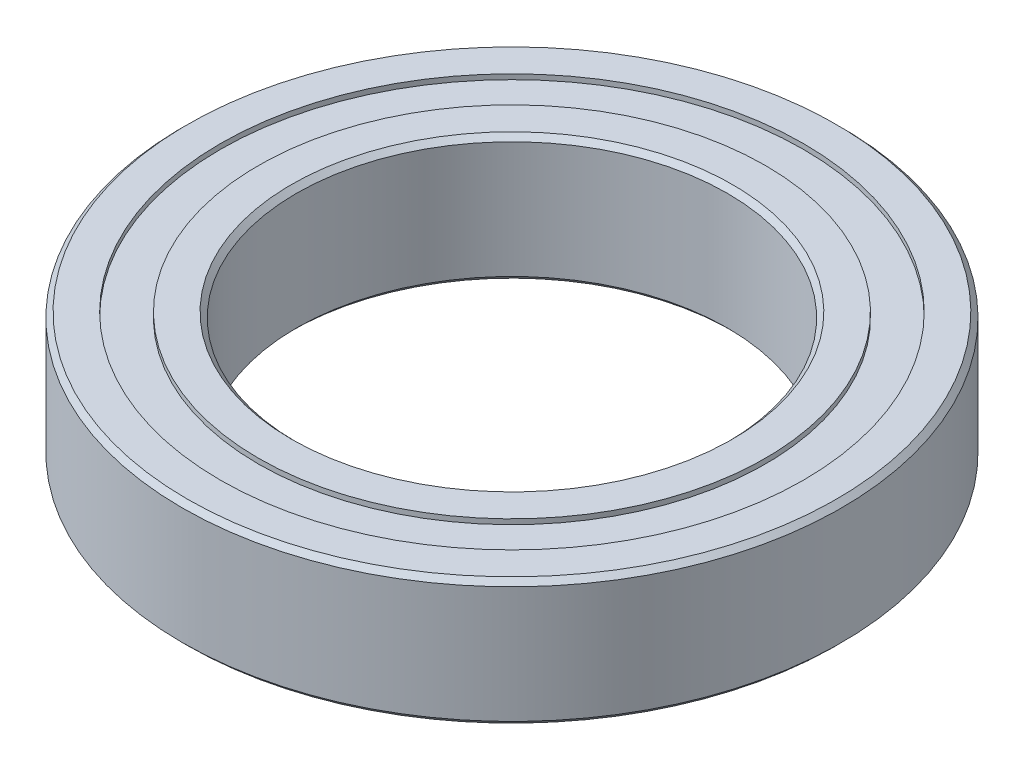
ISO-10303-21;
HEADER;
FILE_DESCRIPTION(('STEP AP214'),'2;1');
FILE_NAME('part.step','',(''),(''),'','','');
FILE_SCHEMA(('AUTOMOTIVE_DESIGN { 1 0 10303 214 1 1 1 1 }'));
ENDSEC;
DATA;
#1=APPLICATION_CONTEXT('core data for automotive mechanical design processes');
#2=APPLICATION_PROTOCOL_DEFINITION('international standard','automotive_design',2000,#1);
#3=PRODUCT_CONTEXT('',#1,'mechanical');
#4=PRODUCT('Part','Part','',(#3));
#5=PRODUCT_RELATED_PRODUCT_CATEGORY('part','',(#4));
#6=PRODUCT_DEFINITION_FORMATION('','',#4);
#7=PRODUCT_DEFINITION_CONTEXT('part definition',#1,'design');
#8=PRODUCT_DEFINITION('design','',#6,#7);
#9=PRODUCT_DEFINITION_SHAPE('','',#8);
#10=(LENGTH_UNIT() NAMED_UNIT(*) SI_UNIT(.MILLI.,.METRE.));
#11=(NAMED_UNIT(*) PLANE_ANGLE_UNIT() SI_UNIT($,.RADIAN.));
#12=(NAMED_UNIT(*) SI_UNIT($,.STERADIAN.) SOLID_ANGLE_UNIT());
#13=UNCERTAINTY_MEASURE_WITH_UNIT(LENGTH_MEASURE(1.E-05),#10,'distance_accuracy_value','');
#14=(GEOMETRIC_REPRESENTATION_CONTEXT(3) GLOBAL_UNCERTAINTY_ASSIGNED_CONTEXT((#13)) GLOBAL_UNIT_ASSIGNED_CONTEXT((#10,
#11,#12)) REPRESENTATION_CONTEXT('',''));
#15=CARTESIAN_POINT('',(0.,0.,0.));
#16=DIRECTION('',(0.,0.,1.));
#17=DIRECTION('',(1.,0.,0.));
#18=AXIS2_PLACEMENT_3D('',#15,#16,#17);
#19=CARTESIAN_POINT('',(0.,0.,0.));
#20=DIRECTION('',(0.,1.,0.));
#21=DIRECTION('',(0.,0.,1.));
#22=AXIS2_PLACEMENT_3D('',#19,#20,#21);
#23=PLANE('',#22);
#24=CARTESIAN_POINT('',(0.,0.,0.));
#25=DIRECTION('',(0.,1.,0.));
#26=DIRECTION('',(0.,0.,1.));
#27=AXIS2_PLACEMENT_3D('',#24,#25,#26);
#28=CIRCLE('',#27,8.7);
#29=CARTESIAN_POINT('',(0.,0.,8.7));
#30=VERTEX_POINT('',#29);
#31=EDGE_CURVE('E10',#30,#30,#28,.T.);
#32=ORIENTED_EDGE('',*,*,#31,.T.);
#33=EDGE_LOOP('',(#32));
#34=FACE_BOUND('',#33,.T.);
#35=CARTESIAN_POINT('',(0.,0.,0.));
#36=DIRECTION('',(0.,-1.,0.));
#37=DIRECTION('',(0.,0.,-1.));
#38=AXIS2_PLACEMENT_3D('',#35,#36,#37);
#39=CIRCLE('',#38,10.);
#40=CARTESIAN_POINT('',(0.,0.,-10.));
#41=VERTEX_POINT('',#40);
#42=EDGE_CURVE('E87',#41,#41,#39,.T.);
#43=ORIENTED_EDGE('',*,*,#42,.T.);
#44=EDGE_LOOP('',(#43));
#45=FACE_BOUND('',#44,.T.);
#46=ADVANCED_FACE('F35',(#34,#45),#23,.F.);
#47=CARTESIAN_POINT('',(0.,5.,0.));
#48=DIRECTION('',(0.,1.,0.));
#49=DIRECTION('',(0.,0.,1.));
#50=AXIS2_PLACEMENT_3D('',#47,#48,#49);
#51=PLANE('',#50);
#52=CARTESIAN_POINT('',(0.,5.,0.));
#53=DIRECTION('',(0.,1.,0.));
#54=DIRECTION('',(0.,0.,1.));
#55=AXIS2_PLACEMENT_3D('',#52,#53,#54);
#56=CIRCLE('',#55,8.70000000000001);
#57=CARTESIAN_POINT('',(0.,5.,8.70000000000001));
#58=VERTEX_POINT('',#57);
#59=EDGE_CURVE('E43',#58,#58,#56,.F.);
#60=ORIENTED_EDGE('',*,*,#59,.T.);
#61=EDGE_LOOP('',(#60));
#62=FACE_BOUND('',#61,.T.);
#63=CARTESIAN_POINT('',(0.,5.,0.));
#64=DIRECTION('',(0.,1.,0.));
#65=DIRECTION('',(0.,0.,1.));
#66=AXIS2_PLACEMENT_3D('',#63,#64,#65);
#67=CIRCLE('',#66,10.);
#68=CARTESIAN_POINT('',(0.,5.,10.));
#69=VERTEX_POINT('',#68);
#70=EDGE_CURVE('E75',#69,#69,#67,.T.);
#71=ORIENTED_EDGE('',*,*,#70,.T.);
#72=EDGE_LOOP('',(#71));
#73=FACE_BOUND('',#72,.T.);
#74=ADVANCED_FACE('F122',(#62,#73),#51,.T.);
#75=CARTESIAN_POINT('',(0.,5.,0.));
#76=DIRECTION('',(0.,1.,0.));
#77=DIRECTION('',(0.,0.,1.));
#78=AXIS2_PLACEMENT_3D('',#75,#76,#77);
#79=CIRCLE('',#78,12.8);
#80=CARTESIAN_POINT('',(0.,5.,12.8));
#81=VERTEX_POINT('',#80);
#82=EDGE_CURVE('E65',#81,#81,#79,.T.);
#83=ORIENTED_EDGE('',*,*,#82,.T.);
#84=EDGE_LOOP('',(#83));
#85=FACE_BOUND('',#84,.T.);
#86=CARTESIAN_POINT('',(0.,5.,0.));
#87=DIRECTION('',(0.,1.,0.));
#88=DIRECTION('',(0.,0.,1.));
#89=AXIS2_PLACEMENT_3D('',#86,#87,#88);
#90=CIRCLE('',#89,11.5);
#91=CARTESIAN_POINT('',(0.,5.,11.5));
#92=VERTEX_POINT('',#91);
#93=EDGE_CURVE('E69',#92,#92,#90,.T.);
#94=ORIENTED_EDGE('',*,*,#93,.F.);
#95=EDGE_LOOP('',(#94));
#96=FACE_BOUND('',#95,.T.);
#97=ADVANCED_FACE('F112',(#85,#96),#51,.T.);
#98=CARTESIAN_POINT('',(0.,0.,0.));
#99=DIRECTION('',(0.,1.,0.));
#100=DIRECTION('',(0.,0.,1.));
#101=AXIS2_PLACEMENT_3D('',#98,#99,#100);
#102=CIRCLE('',#101,12.8);
#103=CARTESIAN_POINT('',(0.,0.,12.8));
#104=VERTEX_POINT('',#103);
#105=EDGE_CURVE('E56',#104,#104,#102,.F.);
#106=ORIENTED_EDGE('',*,*,#105,.T.);
#107=EDGE_LOOP('',(#106));
#108=FACE_BOUND('',#107,.T.);
#109=CARTESIAN_POINT('',(0.,0.,0.));
#110=DIRECTION('',(0.,-1.,0.));
#111=DIRECTION('',(0.,0.,-1.));
#112=AXIS2_PLACEMENT_3D('',#109,#110,#111);
#113=CIRCLE('',#112,11.5);
#114=CARTESIAN_POINT('',(0.,0.,-11.5));
#115=VERTEX_POINT('',#114);
#116=EDGE_CURVE('E81',#115,#115,#113,.T.);
#117=ORIENTED_EDGE('',*,*,#116,.F.);
#118=EDGE_LOOP('',(#117));
#119=FACE_BOUND('',#118,.T.);
#120=ADVANCED_FACE('F109',(#108,#119),#23,.F.);
#121=CARTESIAN_POINT('',(0.,5.,0.));
#122=DIRECTION('',(0.,-1.,0.));
#123=DIRECTION('',(0.,0.,-1.));
#124=AXIS2_PLACEMENT_3D('',#121,#122,#123);
#125=CYLINDRICAL_SURFACE('',#124,13.);
#126=CARTESIAN_POINT('',(0.,4.8,0.));
#127=DIRECTION('',(0.,1.,0.));
#128=DIRECTION('',(0.,0.,1.));
#129=AXIS2_PLACEMENT_3D('',#126,#127,#128);
#130=CIRCLE('',#129,13.);
#131=CARTESIAN_POINT('',(0.,4.8,13.));
#132=VERTEX_POINT('',#131);
#133=EDGE_CURVE('E59',#132,#132,#130,.F.);
#134=ORIENTED_EDGE('',*,*,#133,.T.);
#135=EDGE_LOOP('',(#134));
#136=FACE_BOUND('',#135,.T.);
#137=CARTESIAN_POINT('',(0.,0.199999999999997,0.));
#138=DIRECTION('',(0.,1.,0.));
#139=DIRECTION('',(0.,0.,1.));
#140=AXIS2_PLACEMENT_3D('',#137,#138,#139);
#141=CIRCLE('',#140,13.);
#142=CARTESIAN_POINT('',(0.,0.199999999999997,13.));
#143=VERTEX_POINT('',#142);
#144=EDGE_CURVE('E62',#143,#143,#141,.T.);
#145=ORIENTED_EDGE('',*,*,#144,.T.);
#146=EDGE_LOOP('',(#145));
#147=FACE_BOUND('',#146,.T.);
#148=ADVANCED_FACE('F111',(#136,#147),#125,.T.);
#149=CARTESIAN_POINT('',(0.,5.,0.));
#150=DIRECTION('',(0.,-1.,0.));
#151=DIRECTION('',(0.,0.,-1.));
#152=AXIS2_PLACEMENT_3D('',#149,#150,#151);
#153=CYLINDRICAL_SURFACE('',#152,8.5);
#154=CARTESIAN_POINT('',(0.,4.79999999999999,0.));
#155=DIRECTION('',(0.,1.,0.));
#156=DIRECTION('',(0.,0.,1.));
#157=AXIS2_PLACEMENT_3D('',#154,#155,#156);
#158=CIRCLE('',#157,8.5);
#159=CARTESIAN_POINT('',(0.,4.79999999999999,8.5));
#160=VERTEX_POINT('',#159);
#161=EDGE_CURVE('E47',#160,#160,#158,.T.);
#162=ORIENTED_EDGE('',*,*,#161,.T.);
#163=EDGE_LOOP('',(#162));
#164=FACE_BOUND('',#163,.T.);
#165=CARTESIAN_POINT('',(0.,0.200000000000001,0.));
#166=DIRECTION('',(0.,1.,0.));
#167=DIRECTION('',(0.,0.,1.));
#168=AXIS2_PLACEMENT_3D('',#165,#166,#167);
#169=CIRCLE('',#168,8.5);
#170=CARTESIAN_POINT('',(0.,0.200000000000001,8.5));
#171=VERTEX_POINT('',#170);
#172=EDGE_CURVE('E51',#171,#171,#169,.F.);
#173=ORIENTED_EDGE('',*,*,#172,.T.);
#174=EDGE_LOOP('',(#173));
#175=FACE_BOUND('',#174,.T.);
#176=ADVANCED_FACE('F119',(#164,#175),#153,.F.);
#177=CARTESIAN_POINT('',(0.,4.8,0.));
#178=DIRECTION('',(0.,1.,0.));
#179=DIRECTION('',(0.,0.,1.));
#180=AXIS2_PLACEMENT_3D('',#177,#178,#179);
#181=CYLINDRICAL_SURFACE('',#180,11.5);
#182=CARTESIAN_POINT('',(0.,4.8,0.));
#183=DIRECTION('',(0.,1.,0.));
#184=DIRECTION('',(0.,0.,1.));
#185=AXIS2_PLACEMENT_3D('',#182,#183,#184);
#186=CIRCLE('',#185,11.5);
#187=CARTESIAN_POINT('',(0.,4.8,11.5));
#188=VERTEX_POINT('',#187);
#189=EDGE_CURVE('E68',#188,#188,#186,.T.);
#190=ORIENTED_EDGE('',*,*,#189,.F.);
#191=EDGE_LOOP('',(#190));
#192=FACE_BOUND('',#191,.T.);
#193=ORIENTED_EDGE('',*,*,#93,.T.);
#194=EDGE_LOOP('',(#193));
#195=FACE_BOUND('',#194,.T.);
#196=ADVANCED_FACE('F147',(#192,#195),#181,.F.);
#197=CARTESIAN_POINT('',(0.,4.8,0.));
#198=DIRECTION('',(0.,1.,0.));
#199=DIRECTION('',(0.,0.,1.));
#200=AXIS2_PLACEMENT_3D('',#197,#198,#199);
#201=PLANE('',#200);
#202=CARTESIAN_POINT('',(0.,4.8,0.));
#203=DIRECTION('',(0.,1.,0.));
#204=DIRECTION('',(0.,0.,1.));
#205=AXIS2_PLACEMENT_3D('',#202,#203,#204);
#206=CIRCLE('',#205,10.);
#207=CARTESIAN_POINT('',(0.,4.8,10.));
#208=VERTEX_POINT('',#207);
#209=EDGE_CURVE('E72',#208,#208,#206,.T.);
#210=ORIENTED_EDGE('',*,*,#209,.F.);
#211=EDGE_LOOP('',(#210));
#212=FACE_BOUND('',#211,.T.);
#213=ORIENTED_EDGE('',*,*,#189,.T.);
#214=EDGE_LOOP('',(#213));
#215=FACE_BOUND('',#214,.T.);
#216=ADVANCED_FACE('F143',(#212,#215),#201,.T.);
#217=CARTESIAN_POINT('',(0.,4.8,0.));
#218=DIRECTION('',(0.,1.,0.));
#219=DIRECTION('',(0.,0.,1.));
#220=AXIS2_PLACEMENT_3D('',#217,#218,#219);
#221=CYLINDRICAL_SURFACE('',#220,10.);
#222=ORIENTED_EDGE('',*,*,#209,.T.);
#223=EDGE_LOOP('',(#222));
#224=FACE_BOUND('',#223,.T.);
#225=ORIENTED_EDGE('',*,*,#70,.F.);
#226=EDGE_LOOP('',(#225));
#227=FACE_BOUND('',#226,.T.);
#228=ADVANCED_FACE('F105',(#224,#227),#221,.T.);
#229=CARTESIAN_POINT('',(0.,0.2,0.));
#230=DIRECTION('',(0.,-1.,0.));
#231=DIRECTION('',(0.,0.,-1.));
#232=AXIS2_PLACEMENT_3D('',#229,#230,#231);
#233=CYLINDRICAL_SURFACE('',#232,11.5);
#234=CARTESIAN_POINT('',(0.,0.2,0.));
#235=DIRECTION('',(0.,-1.,0.));
#236=DIRECTION('',(0.,0.,-1.));
#237=AXIS2_PLACEMENT_3D('',#234,#235,#236);
#238=CIRCLE('',#237,11.5);
#239=CARTESIAN_POINT('',(0.,0.2,-11.5));
#240=VERTEX_POINT('',#239);
#241=EDGE_CURVE('E78',#240,#240,#238,.T.);
#242=ORIENTED_EDGE('',*,*,#241,.F.);
#243=EDGE_LOOP('',(#242));
#244=FACE_BOUND('',#243,.T.);
#245=ORIENTED_EDGE('',*,*,#116,.T.);
#246=EDGE_LOOP('',(#245));
#247=FACE_BOUND('',#246,.T.);
#248=ADVANCED_FACE('F99',(#244,#247),#233,.F.);
#249=CARTESIAN_POINT('',(0.,0.2,0.));
#250=DIRECTION('',(0.,-1.,0.));
#251=DIRECTION('',(0.,0.,-1.));
#252=AXIS2_PLACEMENT_3D('',#249,#250,#251);
#253=PLANE('',#252);
#254=CARTESIAN_POINT('',(0.,0.2,0.));
#255=DIRECTION('',(0.,-1.,0.));
#256=DIRECTION('',(0.,0.,-1.));
#257=AXIS2_PLACEMENT_3D('',#254,#255,#256);
#258=CIRCLE('',#257,10.);
#259=CARTESIAN_POINT('',(0.,0.2,-10.));
#260=VERTEX_POINT('',#259);
#261=EDGE_CURVE('E84',#260,#260,#258,.T.);
#262=ORIENTED_EDGE('',*,*,#261,.F.);
#263=EDGE_LOOP('',(#262));
#264=FACE_BOUND('',#263,.T.);
#265=ORIENTED_EDGE('',*,*,#241,.T.);
#266=EDGE_LOOP('',(#265));
#267=FACE_BOUND('',#266,.T.);
#268=ADVANCED_FACE('F96',(#264,#267),#253,.T.);
#269=CARTESIAN_POINT('',(0.,0.2,0.));
#270=DIRECTION('',(0.,-1.,0.));
#271=DIRECTION('',(0.,0.,-1.));
#272=AXIS2_PLACEMENT_3D('',#269,#270,#271);
#273=CYLINDRICAL_SURFACE('',#272,10.);
#274=ORIENTED_EDGE('',*,*,#261,.T.);
#275=EDGE_LOOP('',(#274));
#276=FACE_BOUND('',#275,.T.);
#277=ORIENTED_EDGE('',*,*,#42,.F.);
#278=EDGE_LOOP('',(#277));
#279=FACE_BOUND('',#278,.T.);
#280=ADVANCED_FACE('F93',(#276,#279),#273,.T.);
#281=CARTESIAN_POINT('',(0.,5.,0.));
#282=DIRECTION('',(0.,-1.,0.));
#283=DIRECTION('',(0.,0.,-1.));
#284=AXIS2_PLACEMENT_3D('',#281,#282,#283);
#285=CONICAL_SURFACE('',#284,12.8,0.785398163397461);
#286=ORIENTED_EDGE('',*,*,#133,.F.);
#287=EDGE_LOOP('',(#286));
#288=FACE_BOUND('',#287,.T.);
#289=ORIENTED_EDGE('',*,*,#82,.F.);
#290=EDGE_LOOP('',(#289));
#291=FACE_BOUND('',#290,.T.);
#292=ADVANCED_FACE('F132',(#288,#291),#285,.T.);
#293=CARTESIAN_POINT('',(0.,0.199999999999997,0.));
#294=DIRECTION('',(0.,1.,0.));
#295=DIRECTION('',(0.,0.,1.));
#296=AXIS2_PLACEMENT_3D('',#293,#294,#295);
#297=CONICAL_SURFACE('',#296,13.,0.785398163397448);
#298=ORIENTED_EDGE('',*,*,#105,.F.);
#299=EDGE_LOOP('',(#298));
#300=FACE_BOUND('',#299,.T.);
#301=ORIENTED_EDGE('',*,*,#144,.F.);
#302=EDGE_LOOP('',(#301));
#303=FACE_BOUND('',#302,.T.);
#304=ADVANCED_FACE('F137',(#300,#303),#297,.T.);
#305=CARTESIAN_POINT('',(0.,4.79999999999999,0.));
#306=DIRECTION('',(0.,1.,0.));
#307=DIRECTION('',(0.,0.,1.));
#308=AXIS2_PLACEMENT_3D('',#305,#306,#307);
#309=CONICAL_SURFACE('',#308,8.5,0.785398163397457);
#310=ORIENTED_EDGE('',*,*,#59,.F.);
#311=EDGE_LOOP('',(#310));
#312=FACE_BOUND('',#311,.T.);
#313=ORIENTED_EDGE('',*,*,#161,.F.);
#314=EDGE_LOOP('',(#313));
#315=FACE_BOUND('',#314,.T.);
#316=ADVANCED_FACE('F162',(#312,#315),#309,.F.);
#317=CARTESIAN_POINT('',(0.,0.,0.));
#318=DIRECTION('',(0.,-1.,0.));
#319=DIRECTION('',(0.,0.,-1.));
#320=AXIS2_PLACEMENT_3D('',#317,#318,#319);
#321=CONICAL_SURFACE('',#320,8.7,0.785398163397444);
#322=ORIENTED_EDGE('',*,*,#172,.F.);
#323=EDGE_LOOP('',(#322));
#324=FACE_BOUND('',#323,.T.);
#325=ORIENTED_EDGE('',*,*,#31,.F.);
#326=EDGE_LOOP('',(#325));
#327=FACE_BOUND('',#326,.T.);
#328=ADVANCED_FACE('F38',(#324,#327),#321,.F.);
#329=CLOSED_SHELL('',(#46,#74,#97,#120,#148,#176,#196,#216,#228,#248,#268,#280,#292,#304,#316,#328));
#330=MANIFOLD_SOLID_BREP('B2',#329);
#331=ADVANCED_BREP_SHAPE_REPRESENTATION('',(#18,#330),#14);
#332=SHAPE_DEFINITION_REPRESENTATION(#9,#331);
ENDSEC;
END-ISO-10303-21;
